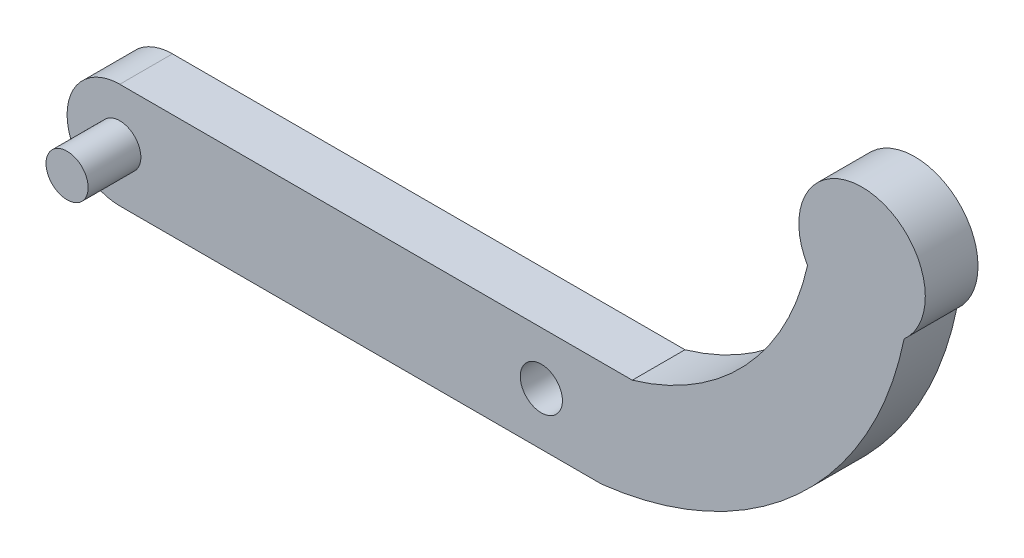
ISO-10303-21;
HEADER;
FILE_DESCRIPTION(('STEP AP214'),'2;1');
FILE_NAME('part.step','',(''),(''),'','','');
FILE_SCHEMA(('AUTOMOTIVE_DESIGN { 1 0 10303 214 1 1 1 1 }'));
ENDSEC;
DATA;
#1=APPLICATION_CONTEXT('core data for automotive mechanical design processes');
#2=APPLICATION_PROTOCOL_DEFINITION('international standard','automotive_design',2000,#1);
#3=PRODUCT_CONTEXT('',#1,'mechanical');
#4=PRODUCT('Part','Part','',(#3));
#5=PRODUCT_RELATED_PRODUCT_CATEGORY('part','',(#4));
#6=PRODUCT_DEFINITION_FORMATION('','',#4);
#7=PRODUCT_DEFINITION_CONTEXT('part definition',#1,'design');
#8=PRODUCT_DEFINITION('design','',#6,#7);
#9=PRODUCT_DEFINITION_SHAPE('','',#8);
#10=(LENGTH_UNIT() NAMED_UNIT(*) SI_UNIT(.MILLI.,.METRE.));
#11=(NAMED_UNIT(*) PLANE_ANGLE_UNIT() SI_UNIT($,.RADIAN.));
#12=(NAMED_UNIT(*) SI_UNIT($,.STERADIAN.) SOLID_ANGLE_UNIT());
#13=UNCERTAINTY_MEASURE_WITH_UNIT(LENGTH_MEASURE(1.E-05),#10,'distance_accuracy_value','');
#14=(GEOMETRIC_REPRESENTATION_CONTEXT(3) GLOBAL_UNCERTAINTY_ASSIGNED_CONTEXT((#13)) GLOBAL_UNIT_ASSIGNED_CONTEXT((#10,
#11,#12)) REPRESENTATION_CONTEXT('',''));
#15=CARTESIAN_POINT('',(0.,0.,0.));
#16=DIRECTION('',(0.,0.,1.));
#17=DIRECTION('',(1.,0.,0.));
#18=AXIS2_PLACEMENT_3D('',#15,#16,#17);
#19=CARTESIAN_POINT('',(2.03365589207616,26.163304852895,5.));
#20=DIRECTION('',(0.,0.,-1.));
#21=DIRECTION('',(-1.,0.,0.));
#22=AXIS2_PLACEMENT_3D('',#19,#20,#21);
#23=CYLINDRICAL_SURFACE('',#22,33.117232058908);
#24=CARTESIAN_POINT('',(2.03365589207616,26.163304852895,0.));
#25=DIRECTION('',(0.,0.,1.));
#26=DIRECTION('',(-1.,0.,0.));
#27=AXIS2_PLACEMENT_3D('',#24,#25,#26);
#28=CIRCLE('',#27,33.117232058908);
#29=CARTESIAN_POINT('',(5.78834827445235,-6.74039318178333,0.));
#30=VERTEX_POINT('',#29);
#31=CARTESIAN_POINT('',(34.4824546363424,19.54314478703,0.));
#32=VERTEX_POINT('',#31);
#33=EDGE_CURVE('E118',#30,#32,#28,.T.);
#34=ORIENTED_EDGE('',*,*,#33,.T.);
#35=DIRECTION('',(0.,0.,-1.));
#36=VECTOR('',#35,1.);
#37=CARTESIAN_POINT('',(34.4824546363424,19.54314478703,5.));
#38=LINE('',#37,#36);
#39=CARTESIAN_POINT('',(34.4824546363424,19.54314478703,5.));
#40=VERTEX_POINT('',#39);
#41=EDGE_CURVE('E11',#40,#32,#38,.T.);
#42=ORIENTED_EDGE('',*,*,#41,.F.);
#43=CARTESIAN_POINT('',(2.03365589207616,26.163304852895,5.));
#44=DIRECTION('',(0.,0.,1.));
#45=DIRECTION('',(-1.,0.,0.));
#46=AXIS2_PLACEMENT_3D('',#43,#44,#45);
#47=CIRCLE('',#46,33.117232058908);
#48=CARTESIAN_POINT('',(5.78834827445235,-6.74039318178333,5.));
#49=VERTEX_POINT('',#48);
#50=EDGE_CURVE('E129',#49,#40,#47,.T.);
#51=ORIENTED_EDGE('',*,*,#50,.F.);
#52=DIRECTION('',(0.,0.,-1.));
#53=VECTOR('',#52,1.);
#54=CARTESIAN_POINT('',(5.78834827445235,-6.74039318178333,5.));
#55=LINE('',#54,#53);
#56=EDGE_CURVE('E114',#49,#30,#55,.T.);
#57=ORIENTED_EDGE('',*,*,#56,.T.);
#58=EDGE_LOOP('',(#34,#42,#51,#57));
#59=FACE_BOUND('',#58,.T.);
#60=ADVANCED_FACE('F33',(#59),#23,.T.);
#61=CARTESIAN_POINT('',(30.4972644912561,24.0284830694238,5.));
#62=DIRECTION('',(0.,0.,-1.));
#63=DIRECTION('',(-1.,0.,0.));
#64=AXIS2_PLACEMENT_3D('',#61,#62,#63);
#65=CYLINDRICAL_SURFACE('',#64,6.00000000000001);
#66=CARTESIAN_POINT('',(30.4972644912561,24.0284830694238,0.));
#67=DIRECTION('',(0.,0.,1.));
#68=DIRECTION('',(-1.,0.,0.));
#69=AXIS2_PLACEMENT_3D('',#66,#67,#68);
#70=CIRCLE('',#69,6.00000000000001);
#71=CARTESIAN_POINT('',(25.319941104363,20.9961040450388,0.));
#72=VERTEX_POINT('',#71);
#73=EDGE_CURVE('E121',#32,#72,#70,.T.);
#74=ORIENTED_EDGE('',*,*,#73,.T.);
#75=DIRECTION('',(0.,0.,-1.));
#76=VECTOR('',#75,1.);
#77=CARTESIAN_POINT('',(25.319941104363,20.9961040450388,5.));
#78=LINE('',#77,#76);
#79=CARTESIAN_POINT('',(25.319941104363,20.9961040450388,5.));
#80=VERTEX_POINT('',#79);
#81=EDGE_CURVE('E42',#80,#72,#78,.T.);
#82=ORIENTED_EDGE('',*,*,#81,.F.);
#83=CARTESIAN_POINT('',(30.4972644912561,24.0284830694238,5.));
#84=DIRECTION('',(0.,0.,1.));
#85=DIRECTION('',(-1.,0.,0.));
#86=AXIS2_PLACEMENT_3D('',#83,#84,#85);
#87=CIRCLE('',#86,6.00000000000001);
#88=EDGE_CURVE('E87',#40,#80,#87,.T.);
#89=ORIENTED_EDGE('',*,*,#88,.F.);
#90=ORIENTED_EDGE('',*,*,#41,.T.);
#91=EDGE_LOOP('',(#74,#82,#89,#90));
#92=FACE_BOUND('',#91,.T.);
#93=ADVANCED_FACE('F155',(#92),#65,.T.);
#94=CARTESIAN_POINT('',(2.03365589207616,26.163304852895,5.));
#95=DIRECTION('',(0.,0.,-1.));
#96=DIRECTION('',(-1.,0.,0.));
#97=AXIS2_PLACEMENT_3D('',#94,#95,#96);
#98=CYLINDRICAL_SURFACE('',#97,23.8526946732791);
#99=CARTESIAN_POINT('',(2.03365589207616,26.163304852895,0.));
#100=DIRECTION('',(0.,0.,-1.));
#101=DIRECTION('',(-1.,0.,0.));
#102=AXIS2_PLACEMENT_3D('',#99,#100,#101);
#103=CIRCLE('',#102,23.8526946732791);
#104=CARTESIAN_POINT('',(8.69486145210441,3.25960681821668,0.));
#105=VERTEX_POINT('',#104);
#106=EDGE_CURVE('E124',#72,#105,#103,.T.);
#107=ORIENTED_EDGE('',*,*,#106,.T.);
#108=DIRECTION('',(0.,0.,-1.));
#109=VECTOR('',#108,1.);
#110=CARTESIAN_POINT('',(8.69486145210441,3.25960681821668,5.));
#111=LINE('',#110,#109);
#112=CARTESIAN_POINT('',(8.69486145210441,3.25960681821668,5.));
#113=VERTEX_POINT('',#112);
#114=EDGE_CURVE('E109',#113,#105,#111,.T.);
#115=ORIENTED_EDGE('',*,*,#114,.F.);
#116=CARTESIAN_POINT('',(2.03365589207616,26.163304852895,5.));
#117=DIRECTION('',(0.,0.,-1.));
#118=DIRECTION('',(-1.,0.,0.));
#119=AXIS2_PLACEMENT_3D('',#116,#117,#118);
#120=CIRCLE('',#119,23.8526946732791);
#121=EDGE_CURVE('E100',#80,#113,#120,.T.);
#122=ORIENTED_EDGE('',*,*,#121,.F.);
#123=ORIENTED_EDGE('',*,*,#81,.T.);
#124=EDGE_LOOP('',(#107,#115,#122,#123));
#125=FACE_BOUND('',#124,.T.);
#126=ADVANCED_FACE('F136',(#125),#98,.F.);
#127=CARTESIAN_POINT('',(8.69486145210441,3.25960681821668,5.));
#128=DIRECTION('',(0.,-1.,0.));
#129=DIRECTION('',(0.,0.,-1.));
#130=AXIS2_PLACEMENT_3D('',#127,#128,#129);
#131=PLANE('',#130);
#132=DIRECTION('',(-1.,0.,0.));
#133=VECTOR('',#132,1.);
#134=CARTESIAN_POINT('',(8.69486145210441,3.25960681821668,0.));
#135=LINE('',#134,#133);
#136=CARTESIAN_POINT('',(-39.9368537807147,3.25960681821667,0.));
#137=VERTEX_POINT('',#136);
#138=EDGE_CURVE('E108',#105,#137,#135,.T.);
#139=ORIENTED_EDGE('',*,*,#138,.T.);
#140=DIRECTION('',(0.,0.,-1.));
#141=VECTOR('',#140,1.);
#142=CARTESIAN_POINT('',(-39.9368537807147,3.25960681821667,5.));
#143=LINE('',#142,#141);
#144=CARTESIAN_POINT('',(-39.9368537807147,3.25960681821667,5.));
#145=VERTEX_POINT('',#144);
#146=EDGE_CURVE('E105',#145,#137,#143,.T.);
#147=ORIENTED_EDGE('',*,*,#146,.F.);
#148=DIRECTION('',(-1.,0.,0.));
#149=VECTOR('',#148,1.);
#150=CARTESIAN_POINT('',(8.69486145210441,3.25960681821668,5.));
#151=LINE('',#150,#149);
#152=EDGE_CURVE('E94',#113,#145,#151,.T.);
#153=ORIENTED_EDGE('',*,*,#152,.F.);
#154=ORIENTED_EDGE('',*,*,#114,.T.);
#155=EDGE_LOOP('',(#139,#147,#153,#154));
#156=FACE_BOUND('',#155,.T.);
#157=ADVANCED_FACE('F106',(#156),#131,.F.);
#158=CARTESIAN_POINT('',(-39.9368537807147,-1.74039318178333,5.));
#159=DIRECTION('',(0.,0.,-1.));
#160=DIRECTION('',(-1.,0.,0.));
#161=AXIS2_PLACEMENT_3D('',#158,#159,#160);
#162=CYLINDRICAL_SURFACE('',#161,5.);
#163=CARTESIAN_POINT('',(-39.9368537807147,-1.74039318178333,0.));
#164=DIRECTION('',(0.,0.,1.));
#165=DIRECTION('',(-1.,0.,0.));
#166=AXIS2_PLACEMENT_3D('',#163,#164,#165);
#167=CIRCLE('',#166,5.);
#168=CARTESIAN_POINT('',(-39.9368537807147,-6.74039318178333,0.));
#169=VERTEX_POINT('',#168);
#170=EDGE_CURVE('E73',#137,#169,#167,.T.);
#171=ORIENTED_EDGE('',*,*,#170,.T.);
#172=DIRECTION('',(0.,0.,-1.));
#173=VECTOR('',#172,1.);
#174=CARTESIAN_POINT('',(-39.9368537807147,-6.74039318178333,5.));
#175=LINE('',#174,#173);
#176=CARTESIAN_POINT('',(-39.9368537807147,-6.74039318178333,5.));
#177=VERTEX_POINT('',#176);
#178=EDGE_CURVE('E110',#177,#169,#175,.T.);
#179=ORIENTED_EDGE('',*,*,#178,.F.);
#180=CARTESIAN_POINT('',(-39.9368537807147,-1.74039318178333,5.));
#181=DIRECTION('',(0.,0.,1.));
#182=DIRECTION('',(-1.,0.,0.));
#183=AXIS2_PLACEMENT_3D('',#180,#181,#182);
#184=CIRCLE('',#183,5.);
#185=EDGE_CURVE('E98',#145,#177,#184,.T.);
#186=ORIENTED_EDGE('',*,*,#185,.F.);
#187=ORIENTED_EDGE('',*,*,#146,.T.);
#188=EDGE_LOOP('',(#171,#179,#186,#187));
#189=FACE_BOUND('',#188,.T.);
#190=ADVANCED_FACE('F112',(#189),#162,.T.);
#191=CARTESIAN_POINT('',(5.78834827445235,-6.74039318178333,5.));
#192=DIRECTION('',(0.,1.,0.));
#193=DIRECTION('',(0.,0.,1.));
#194=AXIS2_PLACEMENT_3D('',#191,#192,#193);
#195=PLANE('',#194);
#196=DIRECTION('',(1.,0.,0.));
#197=VECTOR('',#196,1.);
#198=CARTESIAN_POINT('',(5.78834827445235,-6.74039318178333,0.));
#199=LINE('',#198,#197);
#200=EDGE_CURVE('E79',#169,#30,#199,.T.);
#201=ORIENTED_EDGE('',*,*,#200,.T.);
#202=ORIENTED_EDGE('',*,*,#56,.F.);
#203=DIRECTION('',(1.,0.,0.));
#204=VECTOR('',#203,1.);
#205=CARTESIAN_POINT('',(5.78834827445235,-6.74039318178333,5.));
#206=LINE('',#205,#204);
#207=EDGE_CURVE('E50',#177,#49,#206,.T.);
#208=ORIENTED_EDGE('',*,*,#207,.F.);
#209=ORIENTED_EDGE('',*,*,#178,.T.);
#210=EDGE_LOOP('',(#201,#202,#208,#209));
#211=FACE_BOUND('',#210,.T.);
#212=ADVANCED_FACE('F143',(#211),#195,.F.);
#213=CARTESIAN_POINT('',(2.03365589207616,26.163304852895,5.));
#214=DIRECTION('',(0.,0.,-1.));
#215=DIRECTION('',(-1.,0.,0.));
#216=AXIS2_PLACEMENT_3D('',#213,#214,#215);
#217=PLANE('',#216);
#218=CARTESIAN_POINT('',(0.0631462192852913,-1.74039318178333,5.));
#219=DIRECTION('',(0.,0.,1.));
#220=DIRECTION('',(1.,0.,0.));
#221=AXIS2_PLACEMENT_3D('',#218,#219,#220);
#222=CIRCLE('',#221,2.);
#223=CARTESIAN_POINT('',(2.06314621928529,-1.74039318178333,5.));
#224=VERTEX_POINT('',#223);
#225=EDGE_CURVE('E230',#224,#224,#222,.T.);
#226=ORIENTED_EDGE('',*,*,#225,.F.);
#227=EDGE_LOOP('',(#226));
#228=FACE_BOUND('',#227,.T.);
#229=CARTESIAN_POINT('',(-39.9368537807147,-1.74039318178333,5.));
#230=DIRECTION('',(0.,0.,-1.));
#231=DIRECTION('',(-1.,0.,0.));
#232=AXIS2_PLACEMENT_3D('',#229,#230,#231);
#233=CIRCLE('',#232,2.);
#234=CARTESIAN_POINT('',(-41.9368537807147,-1.74039318178333,5.));
#235=VERTEX_POINT('',#234);
#236=EDGE_CURVE('E122',#235,#235,#233,.T.);
#237=ORIENTED_EDGE('',*,*,#236,.T.);
#238=EDGE_LOOP('',(#237));
#239=FACE_BOUND('',#238,.T.);
#240=ORIENTED_EDGE('',*,*,#50,.T.);
#241=ORIENTED_EDGE('',*,*,#88,.T.);
#242=ORIENTED_EDGE('',*,*,#121,.T.);
#243=ORIENTED_EDGE('',*,*,#152,.T.);
#244=ORIENTED_EDGE('',*,*,#185,.T.);
#245=ORIENTED_EDGE('',*,*,#207,.T.);
#246=EDGE_LOOP('',(#240,#241,#242,#243,#244,#245));
#247=FACE_BOUND('',#246,.T.);
#248=ADVANCED_FACE('F96',(#228,#239,#247),#217,.F.);
#249=CARTESIAN_POINT('',(2.03365589207616,26.163304852895,0.));
#250=DIRECTION('',(0.,0.,-1.));
#251=DIRECTION('',(-1.,0.,0.));
#252=AXIS2_PLACEMENT_3D('',#249,#250,#251);
#253=PLANE('',#252);
#254=CARTESIAN_POINT('',(0.0631462192852913,-1.74039318178333,0.));
#255=DIRECTION('',(0.,0.,-1.));
#256=DIRECTION('',(-1.,0.,0.));
#257=AXIS2_PLACEMENT_3D('',#254,#255,#256);
#258=CIRCLE('',#257,2.);
#259=CARTESIAN_POINT('',(-1.93685378071471,-1.74039318178333,0.));
#260=VERTEX_POINT('',#259);
#261=EDGE_CURVE('E36',#260,#260,#258,.T.);
#262=ORIENTED_EDGE('',*,*,#261,.F.);
#263=EDGE_LOOP('',(#262));
#264=FACE_BOUND('',#263,.T.);
#265=ORIENTED_EDGE('',*,*,#33,.F.);
#266=ORIENTED_EDGE('',*,*,#200,.F.);
#267=ORIENTED_EDGE('',*,*,#170,.F.);
#268=ORIENTED_EDGE('',*,*,#138,.F.);
#269=ORIENTED_EDGE('',*,*,#106,.F.);
#270=ORIENTED_EDGE('',*,*,#73,.F.);
#271=EDGE_LOOP('',(#265,#266,#267,#268,#269,#270));
#272=FACE_BOUND('',#271,.T.);
#273=ADVANCED_FACE('F139',(#264,#272),#253,.T.);
#274=CARTESIAN_POINT('',(-39.9368537807147,-1.74039318178333,10.));
#275=DIRECTION('',(0.,0.,-1.));
#276=DIRECTION('',(-1.,0.,0.));
#277=AXIS2_PLACEMENT_3D('',#274,#275,#276);
#278=CYLINDRICAL_SURFACE('',#277,2.);
#279=CARTESIAN_POINT('',(-39.9368537807147,-1.74039318178333,10.));
#280=DIRECTION('',(0.,0.,-1.));
#281=DIRECTION('',(-1.,0.,0.));
#282=AXIS2_PLACEMENT_3D('',#279,#280,#281);
#283=CIRCLE('',#282,2.);
#284=CARTESIAN_POINT('',(-41.9368537807147,-1.74039318178333,10.));
#285=VERTEX_POINT('',#284);
#286=EDGE_CURVE('E232',#285,#285,#283,.T.);
#287=ORIENTED_EDGE('',*,*,#286,.T.);
#288=EDGE_LOOP('',(#287));
#289=FACE_BOUND('',#288,.T.);
#290=ORIENTED_EDGE('',*,*,#236,.F.);
#291=EDGE_LOOP('',(#290));
#292=FACE_BOUND('',#291,.T.);
#293=ADVANCED_FACE('F183',(#289,#292),#278,.T.);
#294=CARTESIAN_POINT('',(-39.9368537807147,-1.74039318178333,10.));
#295=DIRECTION('',(0.,0.,-1.));
#296=DIRECTION('',(-1.,0.,0.));
#297=AXIS2_PLACEMENT_3D('',#294,#295,#296);
#298=PLANE('',#297);
#299=ORIENTED_EDGE('',*,*,#286,.F.);
#300=EDGE_LOOP('',(#299));
#301=FACE_BOUND('',#300,.T.);
#302=ADVANCED_FACE('F188',(#301),#298,.F.);
#303=CARTESIAN_POINT('',(0.0631462192852913,-1.74039318178333,-5.));
#304=DIRECTION('',(0.,0.,1.));
#305=DIRECTION('',(1.,0.,0.));
#306=AXIS2_PLACEMENT_3D('',#303,#304,#305);
#307=CYLINDRICAL_SURFACE('',#306,2.);
#308=ORIENTED_EDGE('',*,*,#261,.T.);
#309=EDGE_LOOP('',(#308));
#310=FACE_BOUND('',#309,.T.);
#311=ORIENTED_EDGE('',*,*,#225,.T.);
#312=EDGE_LOOP('',(#311));
#313=FACE_BOUND('',#312,.T.);
#314=ADVANCED_FACE('F200',(#310,#313),#307,.F.);
#315=CLOSED_SHELL('',(#60,#93,#126,#157,#190,#212,#248,#273,#293,#302,#314));
#316=MANIFOLD_SOLID_BREP('B2',#315);
#317=ADVANCED_BREP_SHAPE_REPRESENTATION('',(#18,#316),#14);
#318=SHAPE_DEFINITION_REPRESENTATION(#9,#317);
ENDSEC;
END-ISO-10303-21;
